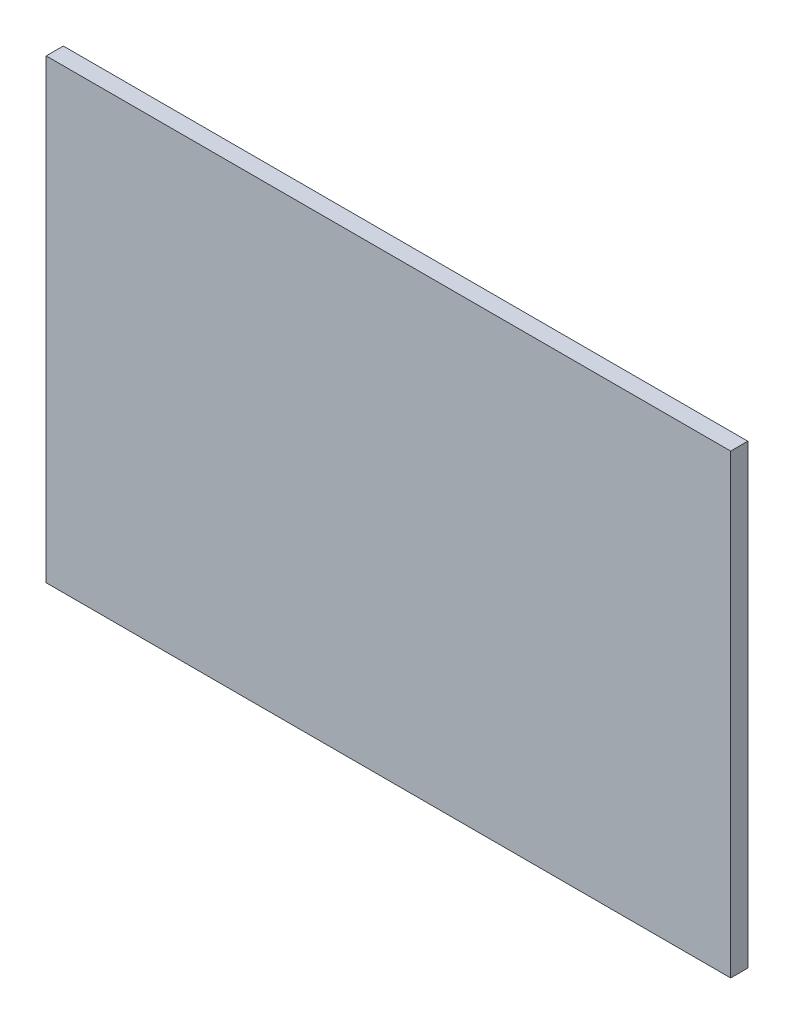
ISO-10303-21;
HEADER;
FILE_DESCRIPTION(('STEP AP214'),'2;1');
FILE_NAME('part.step','',(''),(''),'','','');
FILE_SCHEMA(('AUTOMOTIVE_DESIGN { 1 0 10303 214 1 1 1 1 }'));
ENDSEC;
DATA;
#1=APPLICATION_CONTEXT('core data for automotive mechanical design processes');
#2=APPLICATION_PROTOCOL_DEFINITION('international standard','automotive_design',2000,#1);
#3=PRODUCT_CONTEXT('',#1,'mechanical');
#4=PRODUCT('Part','Part','',(#3));
#5=PRODUCT_RELATED_PRODUCT_CATEGORY('part','',(#4));
#6=PRODUCT_DEFINITION_FORMATION('','',#4);
#7=PRODUCT_DEFINITION_CONTEXT('part definition',#1,'design');
#8=PRODUCT_DEFINITION('design','',#6,#7);
#9=PRODUCT_DEFINITION_SHAPE('','',#8);
#10=(LENGTH_UNIT() NAMED_UNIT(*) SI_UNIT(.MILLI.,.METRE.));
#11=(NAMED_UNIT(*) PLANE_ANGLE_UNIT() SI_UNIT($,.RADIAN.));
#12=(NAMED_UNIT(*) SI_UNIT($,.STERADIAN.) SOLID_ANGLE_UNIT());
#13=UNCERTAINTY_MEASURE_WITH_UNIT(LENGTH_MEASURE(1.E-05),#10,'distance_accuracy_value','');
#14=(GEOMETRIC_REPRESENTATION_CONTEXT(3) GLOBAL_UNCERTAINTY_ASSIGNED_CONTEXT((#13)) GLOBAL_UNIT_ASSIGNED_CONTEXT((#10,
#11,#12)) REPRESENTATION_CONTEXT('',''));
#15=CARTESIAN_POINT('',(0.,0.,0.));
#16=DIRECTION('',(0.,0.,1.));
#17=DIRECTION('',(1.,0.,0.));
#18=AXIS2_PLACEMENT_3D('',#15,#16,#17);
#19=CARTESIAN_POINT('',(-60.,-40.,-3.));
#20=DIRECTION('',(-1.,0.,0.));
#21=DIRECTION('',(0.,0.,1.));
#22=AXIS2_PLACEMENT_3D('',#19,#20,#21);
#23=PLANE('',#22);
#24=DIRECTION('',(0.,-1.,0.));
#25=VECTOR('',#24,1.);
#26=CARTESIAN_POINT('',(-60.,-40.,0.));
#27=LINE('',#26,#25);
#28=CARTESIAN_POINT('',(-60.,40.,0.));
#29=VERTEX_POINT('',#28);
#30=CARTESIAN_POINT('',(-60.,-40.,0.));
#31=VERTEX_POINT('',#30);
#32=EDGE_CURVE('E105',#29,#31,#27,.T.);
#33=ORIENTED_EDGE('',*,*,#32,.F.);
#34=DIRECTION('',(0.,0.,1.));
#35=VECTOR('',#34,1.);
#36=CARTESIAN_POINT('',(-60.,40.,-3.));
#37=LINE('',#36,#35);
#38=CARTESIAN_POINT('',(-60.,40.,-3.));
#39=VERTEX_POINT('',#38);
#40=EDGE_CURVE('E11',#39,#29,#37,.T.);
#41=ORIENTED_EDGE('',*,*,#40,.F.);
#42=DIRECTION('',(0.,-1.,0.));
#43=VECTOR('',#42,1.);
#44=CARTESIAN_POINT('',(-60.,-40.,-3.));
#45=LINE('',#44,#43);
#46=CARTESIAN_POINT('',(-60.,-40.,-3.));
#47=VERTEX_POINT('',#46);
#48=EDGE_CURVE('E99',#39,#47,#45,.T.);
#49=ORIENTED_EDGE('',*,*,#48,.T.);
#50=DIRECTION('',(0.,0.,1.));
#51=VECTOR('',#50,1.);
#52=CARTESIAN_POINT('',(-60.,-40.,-3.));
#53=LINE('',#52,#51);
#54=EDGE_CURVE('E44',#47,#31,#53,.T.);
#55=ORIENTED_EDGE('',*,*,#54,.T.);
#56=EDGE_LOOP('',(#33,#41,#49,#55));
#57=FACE_BOUND('',#56,.T.);
#58=ADVANCED_FACE('F41',(#57),#23,.T.);
#59=CARTESIAN_POINT('',(-60.,40.,-3.));
#60=DIRECTION('',(0.,1.,0.));
#61=DIRECTION('',(0.,0.,1.));
#62=AXIS2_PLACEMENT_3D('',#59,#60,#61);
#63=PLANE('',#62);
#64=DIRECTION('',(-1.,0.,0.));
#65=VECTOR('',#64,1.);
#66=CARTESIAN_POINT('',(-60.,40.,0.));
#67=LINE('',#66,#65);
#68=CARTESIAN_POINT('',(60.,40.,0.));
#69=VERTEX_POINT('',#68);
#70=EDGE_CURVE('E101',#69,#29,#67,.T.);
#71=ORIENTED_EDGE('',*,*,#70,.F.);
#72=DIRECTION('',(0.,0.,1.));
#73=VECTOR('',#72,1.);
#74=CARTESIAN_POINT('',(60.,40.,-3.));
#75=LINE('',#74,#73);
#76=CARTESIAN_POINT('',(60.,40.,-3.));
#77=VERTEX_POINT('',#76);
#78=EDGE_CURVE('E50',#77,#69,#75,.T.);
#79=ORIENTED_EDGE('',*,*,#78,.F.);
#80=DIRECTION('',(-1.,0.,0.));
#81=VECTOR('',#80,1.);
#82=CARTESIAN_POINT('',(-60.,40.,-3.));
#83=LINE('',#82,#81);
#84=EDGE_CURVE('E96',#77,#39,#83,.T.);
#85=ORIENTED_EDGE('',*,*,#84,.T.);
#86=ORIENTED_EDGE('',*,*,#40,.T.);
#87=EDGE_LOOP('',(#71,#79,#85,#86));
#88=FACE_BOUND('',#87,.T.);
#89=ADVANCED_FACE('F115',(#88),#63,.T.);
#90=CARTESIAN_POINT('',(60.,-40.,-3.));
#91=DIRECTION('',(1.,0.,0.));
#92=DIRECTION('',(0.,0.,-1.));
#93=AXIS2_PLACEMENT_3D('',#90,#91,#92);
#94=PLANE('',#93);
#95=DIRECTION('',(0.,1.,0.));
#96=VECTOR('',#95,1.);
#97=CARTESIAN_POINT('',(60.,-40.,0.));
#98=LINE('',#97,#96);
#99=CARTESIAN_POINT('',(60.,-40.,0.));
#100=VERTEX_POINT('',#99);
#101=EDGE_CURVE('E91',#100,#69,#98,.T.);
#102=ORIENTED_EDGE('',*,*,#101,.F.);
#103=DIRECTION('',(0.,0.,1.));
#104=VECTOR('',#103,1.);
#105=CARTESIAN_POINT('',(60.,-40.,-3.));
#106=LINE('',#105,#104);
#107=CARTESIAN_POINT('',(60.,-40.,-3.));
#108=VERTEX_POINT('',#107);
#109=EDGE_CURVE('E86',#108,#100,#106,.T.);
#110=ORIENTED_EDGE('',*,*,#109,.F.);
#111=DIRECTION('',(0.,1.,0.));
#112=VECTOR('',#111,1.);
#113=CARTESIAN_POINT('',(60.,-40.,-3.));
#114=LINE('',#113,#112);
#115=EDGE_CURVE('E89',#108,#77,#114,.T.);
#116=ORIENTED_EDGE('',*,*,#115,.T.);
#117=ORIENTED_EDGE('',*,*,#78,.T.);
#118=EDGE_LOOP('',(#102,#110,#116,#117));
#119=FACE_BOUND('',#118,.T.);
#120=ADVANCED_FACE('F88',(#119),#94,.T.);
#121=CARTESIAN_POINT('',(-60.,-40.,-3.));
#122=DIRECTION('',(0.,-1.,0.));
#123=DIRECTION('',(0.,0.,-1.));
#124=AXIS2_PLACEMENT_3D('',#121,#122,#123);
#125=PLANE('',#124);
#126=DIRECTION('',(1.,0.,0.));
#127=VECTOR('',#126,1.);
#128=CARTESIAN_POINT('',(-60.,-40.,0.));
#129=LINE('',#128,#127);
#130=EDGE_CURVE('E108',#31,#100,#129,.T.);
#131=ORIENTED_EDGE('',*,*,#130,.F.);
#132=ORIENTED_EDGE('',*,*,#54,.F.);
#133=DIRECTION('',(1.,0.,0.));
#134=VECTOR('',#133,1.);
#135=CARTESIAN_POINT('',(-60.,-40.,-3.));
#136=LINE('',#135,#134);
#137=EDGE_CURVE('E95',#47,#108,#136,.T.);
#138=ORIENTED_EDGE('',*,*,#137,.T.);
#139=ORIENTED_EDGE('',*,*,#109,.T.);
#140=EDGE_LOOP('',(#131,#132,#138,#139));
#141=FACE_BOUND('',#140,.T.);
#142=ADVANCED_FACE('F98',(#141),#125,.T.);
#143=CARTESIAN_POINT('',(0.,0.,-3.));
#144=DIRECTION('',(0.,0.,-1.));
#145=DIRECTION('',(-1.,0.,0.));
#146=AXIS2_PLACEMENT_3D('',#143,#144,#145);
#147=PLANE('',#146);
#148=ORIENTED_EDGE('',*,*,#48,.F.);
#149=ORIENTED_EDGE('',*,*,#84,.F.);
#150=ORIENTED_EDGE('',*,*,#115,.F.);
#151=ORIENTED_EDGE('',*,*,#137,.F.);
#152=EDGE_LOOP('',(#148,#149,#150,#151));
#153=FACE_BOUND('',#152,.T.);
#154=ADVANCED_FACE('F94',(#153),#147,.T.);
#155=CARTESIAN_POINT('',(0.,0.,0.));
#156=DIRECTION('',(0.,0.,-1.));
#157=DIRECTION('',(-1.,0.,0.));
#158=AXIS2_PLACEMENT_3D('',#155,#156,#157);
#159=PLANE('',#158);
#160=ORIENTED_EDGE('',*,*,#32,.T.);
#161=ORIENTED_EDGE('',*,*,#130,.T.);
#162=ORIENTED_EDGE('',*,*,#101,.T.);
#163=ORIENTED_EDGE('',*,*,#70,.T.);
#164=EDGE_LOOP('',(#160,#161,#162,#163));
#165=FACE_BOUND('',#164,.T.);
#166=ADVANCED_FACE('F114',(#165),#159,.F.);
#167=CLOSED_SHELL('',(#58,#89,#120,#142,#154,#166));
#168=MANIFOLD_SOLID_BREP('B2',#167);
#169=ADVANCED_BREP_SHAPE_REPRESENTATION('',(#18,#168),#14);
#170=SHAPE_DEFINITION_REPRESENTATION(#9,#169);
ENDSEC;
END-ISO-10303-21;
